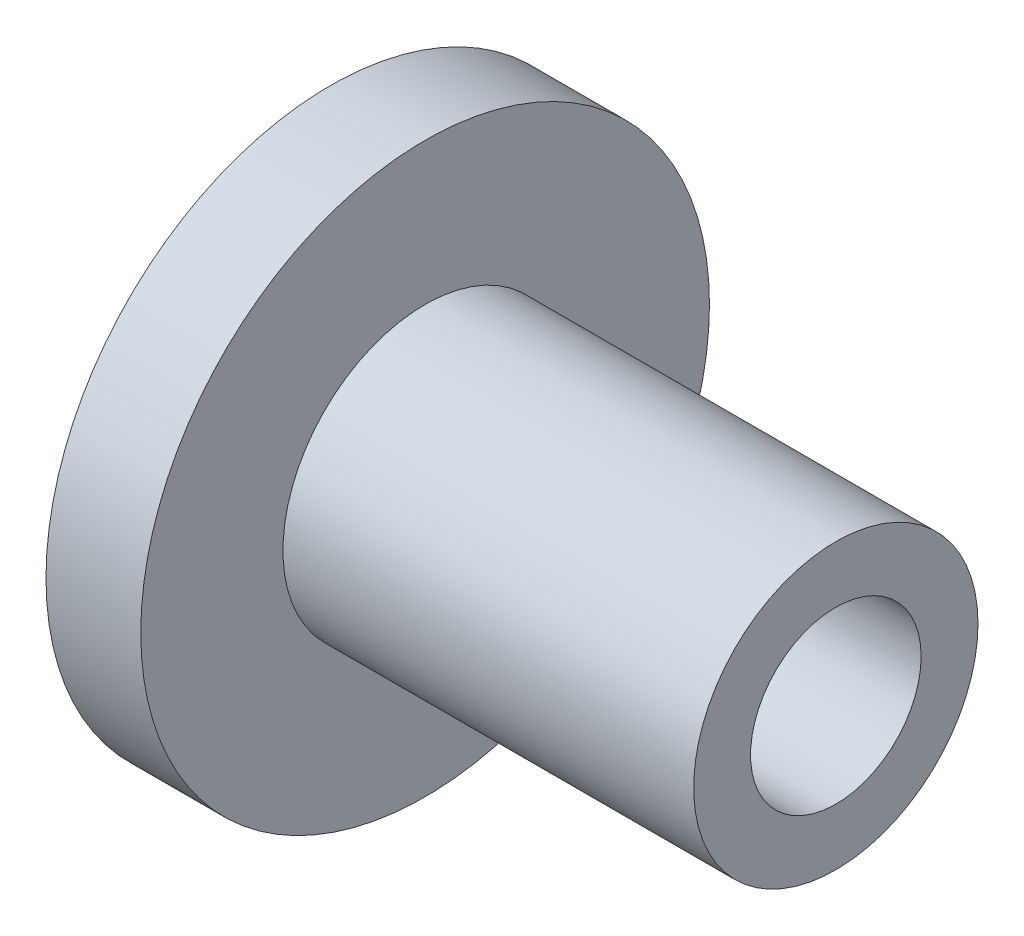
ISO-10303-21;
HEADER;
FILE_DESCRIPTION(('STEP AP214'),'2;1');
FILE_NAME('part.step','',(''),(''),'','','');
FILE_SCHEMA(('AUTOMOTIVE_DESIGN { 1 0 10303 214 1 1 1 1 }'));
ENDSEC;
DATA;
#1=APPLICATION_CONTEXT('core data for automotive mechanical design processes');
#2=APPLICATION_PROTOCOL_DEFINITION('international standard','automotive_design',2000,#1);
#3=PRODUCT_CONTEXT('',#1,'mechanical');
#4=PRODUCT('Part','Part','',(#3));
#5=PRODUCT_RELATED_PRODUCT_CATEGORY('part','',(#4));
#6=PRODUCT_DEFINITION_FORMATION('','',#4);
#7=PRODUCT_DEFINITION_CONTEXT('part definition',#1,'design');
#8=PRODUCT_DEFINITION('design','',#6,#7);
#9=PRODUCT_DEFINITION_SHAPE('','',#8);
#10=(LENGTH_UNIT() NAMED_UNIT(*) SI_UNIT(.MILLI.,.METRE.));
#11=(NAMED_UNIT(*) PLANE_ANGLE_UNIT() SI_UNIT($,.RADIAN.));
#12=(NAMED_UNIT(*) SI_UNIT($,.STERADIAN.) SOLID_ANGLE_UNIT());
#13=UNCERTAINTY_MEASURE_WITH_UNIT(LENGTH_MEASURE(1.E-05),#10,'distance_accuracy_value','');
#14=(GEOMETRIC_REPRESENTATION_CONTEXT(3) GLOBAL_UNCERTAINTY_ASSIGNED_CONTEXT((#13)) GLOBAL_UNIT_ASSIGNED_CONTEXT((#10,
#11,#12)) REPRESENTATION_CONTEXT('',''));
#15=CARTESIAN_POINT('',(0.,0.,0.));
#16=DIRECTION('',(0.,0.,1.));
#17=DIRECTION('',(1.,0.,0.));
#18=AXIS2_PLACEMENT_3D('',#15,#16,#17);
#19=CARTESIAN_POINT('',(0.,0.,0.));
#20=DIRECTION('',(1.,0.,0.));
#21=DIRECTION('',(0.,0.,-1.));
#22=AXIS2_PLACEMENT_3D('',#19,#20,#21);
#23=CYLINDRICAL_SURFACE('',#22,4.5);
#24=CARTESIAN_POINT('',(0.,0.,0.));
#25=DIRECTION('',(1.,0.,0.));
#26=DIRECTION('',(0.,0.,-1.));
#27=AXIS2_PLACEMENT_3D('',#24,#25,#26);
#28=CIRCLE('',#27,4.5);
#29=CARTESIAN_POINT('',(0.,0.,-4.5));
#30=VERTEX_POINT('',#29);
#31=EDGE_CURVE('E55',#30,#30,#28,.T.);
#32=ORIENTED_EDGE('',*,*,#31,.T.);
#33=EDGE_LOOP('',(#32));
#34=FACE_BOUND('',#33,.T.);
#35=CARTESIAN_POINT('',(1.5,0.,0.));
#36=DIRECTION('',(1.,0.,0.));
#37=DIRECTION('',(0.,0.,-1.));
#38=AXIS2_PLACEMENT_3D('',#35,#36,#37);
#39=CIRCLE('',#38,4.5);
#40=CARTESIAN_POINT('',(1.5,0.,-4.5));
#41=VERTEX_POINT('',#40);
#42=EDGE_CURVE('E10',#41,#41,#39,.T.);
#43=ORIENTED_EDGE('',*,*,#42,.F.);
#44=EDGE_LOOP('',(#43));
#45=FACE_BOUND('',#44,.T.);
#46=ADVANCED_FACE('F33',(#34,#45),#23,.T.);
#47=CARTESIAN_POINT('',(1.5,4.5,0.));
#48=DIRECTION('',(1.,0.,0.));
#49=DIRECTION('',(0.,0.,-1.));
#50=AXIS2_PLACEMENT_3D('',#47,#48,#49);
#51=PLANE('',#50);
#52=ORIENTED_EDGE('',*,*,#42,.T.);
#53=EDGE_LOOP('',(#52));
#54=FACE_BOUND('',#53,.T.);
#55=CARTESIAN_POINT('',(1.5,0.,0.));
#56=DIRECTION('',(1.,0.,0.));
#57=DIRECTION('',(0.,0.,-1.));
#58=AXIS2_PLACEMENT_3D('',#55,#56,#57);
#59=CIRCLE('',#58,2.25);
#60=CARTESIAN_POINT('',(1.5,0.,-2.25));
#61=VERTEX_POINT('',#60);
#62=EDGE_CURVE('E39',#61,#61,#59,.T.);
#63=ORIENTED_EDGE('',*,*,#62,.F.);
#64=EDGE_LOOP('',(#63));
#65=FACE_BOUND('',#64,.T.);
#66=ADVANCED_FACE('F73',(#54,#65),#51,.T.);
#67=CARTESIAN_POINT('',(0.,0.,0.));
#68=DIRECTION('',(1.,0.,0.));
#69=DIRECTION('',(0.,0.,-1.));
#70=AXIS2_PLACEMENT_3D('',#67,#68,#69);
#71=CYLINDRICAL_SURFACE('',#70,2.25);
#72=ORIENTED_EDGE('',*,*,#62,.T.);
#73=EDGE_LOOP('',(#72));
#74=FACE_BOUND('',#73,.T.);
#75=CARTESIAN_POINT('',(8.,0.,0.));
#76=DIRECTION('',(1.,0.,0.));
#77=DIRECTION('',(0.,0.,-1.));
#78=AXIS2_PLACEMENT_3D('',#75,#76,#77);
#79=CIRCLE('',#78,2.25);
#80=CARTESIAN_POINT('',(8.,0.,-2.25));
#81=VERTEX_POINT('',#80);
#82=EDGE_CURVE('E43',#81,#81,#79,.T.);
#83=ORIENTED_EDGE('',*,*,#82,.F.);
#84=EDGE_LOOP('',(#83));
#85=FACE_BOUND('',#84,.T.);
#86=ADVANCED_FACE('F77',(#74,#85),#71,.T.);
#87=CARTESIAN_POINT('',(8.,2.25,0.));
#88=DIRECTION('',(1.,0.,0.));
#89=DIRECTION('',(0.,0.,-1.));
#90=AXIS2_PLACEMENT_3D('',#87,#88,#89);
#91=PLANE('',#90);
#92=ORIENTED_EDGE('',*,*,#82,.T.);
#93=EDGE_LOOP('',(#92));
#94=FACE_BOUND('',#93,.T.);
#95=CARTESIAN_POINT('',(8.,0.,0.));
#96=DIRECTION('',(1.,0.,0.));
#97=DIRECTION('',(0.,0.,-1.));
#98=AXIS2_PLACEMENT_3D('',#95,#96,#97);
#99=CIRCLE('',#98,1.35);
#100=CARTESIAN_POINT('',(8.,0.,-1.35));
#101=VERTEX_POINT('',#100);
#102=EDGE_CURVE('E47',#101,#101,#99,.T.);
#103=ORIENTED_EDGE('',*,*,#102,.F.);
#104=EDGE_LOOP('',(#103));
#105=FACE_BOUND('',#104,.T.);
#106=ADVANCED_FACE('F69',(#94,#105),#91,.T.);
#107=CARTESIAN_POINT('',(0.,0.,0.));
#108=DIRECTION('',(1.,0.,0.));
#109=DIRECTION('',(0.,0.,-1.));
#110=AXIS2_PLACEMENT_3D('',#107,#108,#109);
#111=CYLINDRICAL_SURFACE('',#110,1.35);
#112=ORIENTED_EDGE('',*,*,#102,.T.);
#113=EDGE_LOOP('',(#112));
#114=FACE_BOUND('',#113,.T.);
#115=CARTESIAN_POINT('',(0.,0.,0.));
#116=DIRECTION('',(1.,0.,0.));
#117=DIRECTION('',(0.,0.,-1.));
#118=AXIS2_PLACEMENT_3D('',#115,#116,#117);
#119=CIRCLE('',#118,1.35);
#120=CARTESIAN_POINT('',(0.,0.,-1.35));
#121=VERTEX_POINT('',#120);
#122=EDGE_CURVE('E52',#121,#121,#119,.T.);
#123=ORIENTED_EDGE('',*,*,#122,.F.);
#124=EDGE_LOOP('',(#123));
#125=FACE_BOUND('',#124,.T.);
#126=ADVANCED_FACE('F63',(#114,#125),#111,.F.);
#127=CARTESIAN_POINT('',(0.,1.35,0.));
#128=DIRECTION('',(-1.,0.,0.));
#129=DIRECTION('',(0.,0.,1.));
#130=AXIS2_PLACEMENT_3D('',#127,#128,#129);
#131=PLANE('',#130);
#132=ORIENTED_EDGE('',*,*,#122,.T.);
#133=EDGE_LOOP('',(#132));
#134=FACE_BOUND('',#133,.T.);
#135=ORIENTED_EDGE('',*,*,#31,.F.);
#136=EDGE_LOOP('',(#135));
#137=FACE_BOUND('',#136,.T.);
#138=ADVANCED_FACE('F61',(#134,#137),#131,.T.);
#139=CLOSED_SHELL('',(#46,#66,#86,#106,#126,#138));
#140=MANIFOLD_SOLID_BREP('B2',#139);
#141=ADVANCED_BREP_SHAPE_REPRESENTATION('',(#18,#140),#14);
#142=SHAPE_DEFINITION_REPRESENTATION(#9,#141);
ENDSEC;
END-ISO-10303-21;
